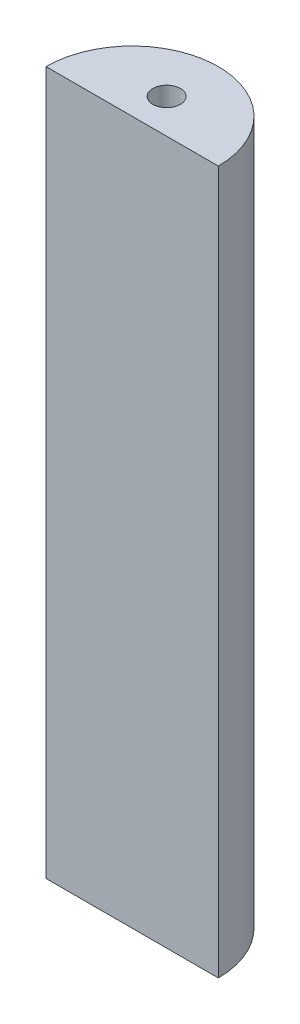
ISO-10303-21;
HEADER;
FILE_DESCRIPTION(('STEP AP214'),'2;1');
FILE_NAME('part.step','',(''),(''),'','','');
FILE_SCHEMA(('AUTOMOTIVE_DESIGN { 1 0 10303 214 1 1 1 1 }'));
ENDSEC;
DATA;
#1=APPLICATION_CONTEXT('core data for automotive mechanical design processes');
#2=APPLICATION_PROTOCOL_DEFINITION('international standard','automotive_design',2000,#1);
#3=PRODUCT_CONTEXT('',#1,'mechanical');
#4=PRODUCT('Part','Part','',(#3));
#5=PRODUCT_RELATED_PRODUCT_CATEGORY('part','',(#4));
#6=PRODUCT_DEFINITION_FORMATION('','',#4);
#7=PRODUCT_DEFINITION_CONTEXT('part definition',#1,'design');
#8=PRODUCT_DEFINITION('design','',#6,#7);
#9=PRODUCT_DEFINITION_SHAPE('','',#8);
#10=(LENGTH_UNIT() NAMED_UNIT(*) SI_UNIT(.MILLI.,.METRE.));
#11=(NAMED_UNIT(*) PLANE_ANGLE_UNIT() SI_UNIT($,.RADIAN.));
#12=(NAMED_UNIT(*) SI_UNIT($,.STERADIAN.) SOLID_ANGLE_UNIT());
#13=UNCERTAINTY_MEASURE_WITH_UNIT(LENGTH_MEASURE(1.E-05),#10,'distance_accuracy_value','');
#14=(GEOMETRIC_REPRESENTATION_CONTEXT(3) GLOBAL_UNCERTAINTY_ASSIGNED_CONTEXT((#13)) GLOBAL_UNIT_ASSIGNED_CONTEXT((#10,
#11,#12)) REPRESENTATION_CONTEXT('',''));
#15=CARTESIAN_POINT('',(0.,0.,0.));
#16=DIRECTION('',(0.,0.,1.));
#17=DIRECTION('',(1.,0.,0.));
#18=AXIS2_PLACEMENT_3D('',#15,#16,#17);
#19=CARTESIAN_POINT('',(0.,51.,0.));
#20=DIRECTION('',(0.,1.,0.));
#21=DIRECTION('',(0.,0.,1.));
#22=AXIS2_PLACEMENT_3D('',#19,#20,#21);
#23=PLANE('',#22);
#24=CARTESIAN_POINT('',(0.,51.,0.));
#25=DIRECTION('',(0.,1.,0.));
#26=DIRECTION('',(0.,0.,1.));
#27=AXIS2_PLACEMENT_3D('',#24,#25,#26);
#28=CIRCLE('',#27,6.25);
#29=CARTESIAN_POINT('',(6.25,51.,0.));
#30=VERTEX_POINT('',#29);
#31=CARTESIAN_POINT('',(-6.25,51.,0.));
#32=VERTEX_POINT('',#31);
#33=EDGE_CURVE('E70',#30,#32,#28,.T.);
#34=ORIENTED_EDGE('',*,*,#33,.T.);
#35=DIRECTION('',(1.,0.,0.));
#36=VECTOR('',#35,1.);
#37=CARTESIAN_POINT('',(-6.25,51.,0.));
#38=LINE('',#37,#36);
#39=EDGE_CURVE('E55',#32,#30,#38,.T.);
#40=ORIENTED_EDGE('',*,*,#39,.T.);
#41=EDGE_LOOP('',(#34,#40));
#42=FACE_BOUND('',#41,.T.);
#43=CARTESIAN_POINT('',(0.,51.,-2.5));
#44=DIRECTION('',(0.,1.,0.));
#45=DIRECTION('',(0.,0.,1.));
#46=AXIS2_PLACEMENT_3D('',#43,#44,#45);
#47=CIRCLE('',#46,1.);
#48=CARTESIAN_POINT('',(0.,51.,-1.5));
#49=VERTEX_POINT('',#48);
#50=EDGE_CURVE('E76',#49,#49,#47,.T.);
#51=ORIENTED_EDGE('',*,*,#50,.F.);
#52=EDGE_LOOP('',(#51));
#53=FACE_BOUND('',#52,.T.);
#54=ADVANCED_FACE('F39',(#42,#53),#23,.T.);
#55=CARTESIAN_POINT('',(0.,0.,0.));
#56=DIRECTION('',(0.,1.,0.));
#57=DIRECTION('',(0.,0.,1.));
#58=AXIS2_PLACEMENT_3D('',#55,#56,#57);
#59=PLANE('',#58);
#60=CARTESIAN_POINT('',(0.,0.,0.));
#61=DIRECTION('',(0.,1.,0.));
#62=DIRECTION('',(0.,0.,1.));
#63=AXIS2_PLACEMENT_3D('',#60,#61,#62);
#64=CIRCLE('',#63,6.25);
#65=CARTESIAN_POINT('',(6.25,0.,0.));
#66=VERTEX_POINT('',#65);
#67=CARTESIAN_POINT('',(-6.25,0.,0.));
#68=VERTEX_POINT('',#67);
#69=EDGE_CURVE('E71',#66,#68,#64,.T.);
#70=ORIENTED_EDGE('',*,*,#69,.F.);
#71=DIRECTION('',(1.,0.,0.));
#72=VECTOR('',#71,1.);
#73=CARTESIAN_POINT('',(-6.25,0.,0.));
#74=LINE('',#73,#72);
#75=EDGE_CURVE('E63',#68,#66,#74,.T.);
#76=ORIENTED_EDGE('',*,*,#75,.F.);
#77=EDGE_LOOP('',(#70,#76));
#78=FACE_BOUND('',#77,.T.);
#79=CARTESIAN_POINT('',(0.,0.,-2.5));
#80=DIRECTION('',(0.,1.,0.));
#81=DIRECTION('',(0.,0.,1.));
#82=AXIS2_PLACEMENT_3D('',#79,#80,#81);
#83=CIRCLE('',#82,1.);
#84=CARTESIAN_POINT('',(0.,0.,-1.5));
#85=VERTEX_POINT('',#84);
#86=EDGE_CURVE('E79',#85,#85,#83,.T.);
#87=ORIENTED_EDGE('',*,*,#86,.T.);
#88=EDGE_LOOP('',(#87));
#89=FACE_BOUND('',#88,.T.);
#90=ADVANCED_FACE('F74',(#78,#89),#59,.F.);
#91=CARTESIAN_POINT('',(0.,51.,0.));
#92=DIRECTION('',(0.,-1.,0.));
#93=DIRECTION('',(0.,0.,-1.));
#94=AXIS2_PLACEMENT_3D('',#91,#92,#93);
#95=CYLINDRICAL_SURFACE('',#94,6.25);
#96=ORIENTED_EDGE('',*,*,#69,.T.);
#97=DIRECTION('',(0.,-1.,0.));
#98=VECTOR('',#97,1.);
#99=CARTESIAN_POINT('',(-6.25,51.,0.));
#100=LINE('',#99,#98);
#101=EDGE_CURVE('E11',#32,#68,#100,.T.);
#102=ORIENTED_EDGE('',*,*,#101,.F.);
#103=ORIENTED_EDGE('',*,*,#33,.F.);
#104=DIRECTION('',(0.,-1.,0.));
#105=VECTOR('',#104,1.);
#106=CARTESIAN_POINT('',(6.25,51.,0.));
#107=LINE('',#106,#105);
#108=EDGE_CURVE('E48',#30,#66,#107,.T.);
#109=ORIENTED_EDGE('',*,*,#108,.T.);
#110=EDGE_LOOP('',(#96,#102,#103,#109));
#111=FACE_BOUND('',#110,.T.);
#112=ADVANCED_FACE('F41',(#111),#95,.T.);
#113=CARTESIAN_POINT('',(-6.25,51.,0.));
#114=DIRECTION('',(0.,0.,-1.));
#115=DIRECTION('',(-1.,0.,0.));
#116=AXIS2_PLACEMENT_3D('',#113,#114,#115);
#117=PLANE('',#116);
#118=ORIENTED_EDGE('',*,*,#75,.T.);
#119=ORIENTED_EDGE('',*,*,#108,.F.);
#120=ORIENTED_EDGE('',*,*,#39,.F.);
#121=ORIENTED_EDGE('',*,*,#101,.T.);
#122=EDGE_LOOP('',(#118,#119,#120,#121));
#123=FACE_BOUND('',#122,.T.);
#124=ADVANCED_FACE('F66',(#123),#117,.F.);
#125=CARTESIAN_POINT('',(0.,51.,-2.5));
#126=DIRECTION('',(0.,-1.,0.));
#127=DIRECTION('',(0.,0.,-1.));
#128=AXIS2_PLACEMENT_3D('',#125,#126,#127);
#129=CYLINDRICAL_SURFACE('',#128,1.);
#130=ORIENTED_EDGE('',*,*,#50,.T.);
#131=EDGE_LOOP('',(#130));
#132=FACE_BOUND('',#131,.T.);
#133=ORIENTED_EDGE('',*,*,#86,.F.);
#134=EDGE_LOOP('',(#133));
#135=FACE_BOUND('',#134,.T.);
#136=ADVANCED_FACE('F87',(#132,#135),#129,.F.);
#137=CLOSED_SHELL('',(#54,#90,#112,#124,#136));
#138=MANIFOLD_SOLID_BREP('B2',#137);
#139=ADVANCED_BREP_SHAPE_REPRESENTATION('',(#18,#138),#14);
#140=SHAPE_DEFINITION_REPRESENTATION(#9,#139);
ENDSEC;
END-ISO-10303-21;
